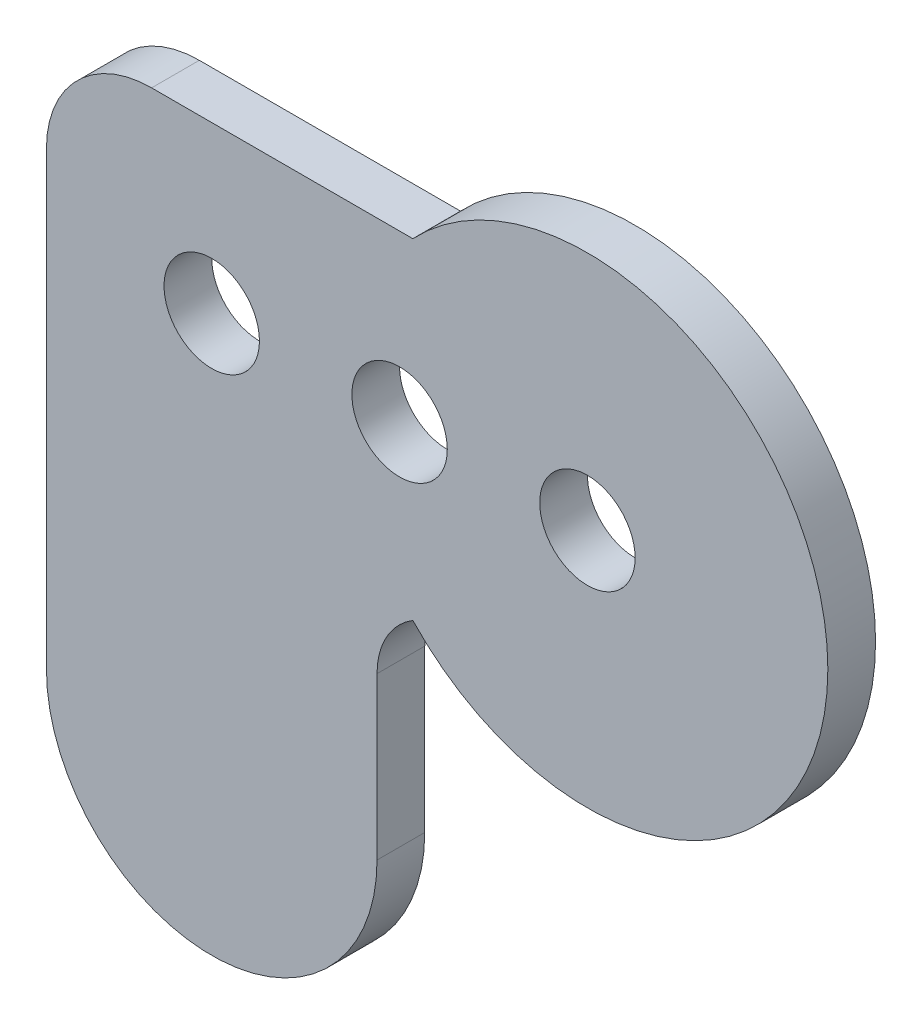
ISO-10303-21;
HEADER;
FILE_DESCRIPTION(('STEP AP214'),'2;1');
FILE_NAME('part.step','',(''),(''),'','','');
FILE_SCHEMA(('AUTOMOTIVE_DESIGN { 1 0 10303 214 1 1 1 1 }'));
ENDSEC;
DATA;
#1=APPLICATION_CONTEXT('core data for automotive mechanical design processes');
#2=APPLICATION_PROTOCOL_DEFINITION('international standard','automotive_design',2000,#1);
#3=PRODUCT_CONTEXT('',#1,'mechanical');
#4=PRODUCT('Part','Part','',(#3));
#5=PRODUCT_RELATED_PRODUCT_CATEGORY('part','',(#4));
#6=PRODUCT_DEFINITION_FORMATION('','',#4);
#7=PRODUCT_DEFINITION_CONTEXT('part definition',#1,'design');
#8=PRODUCT_DEFINITION('design','',#6,#7);
#9=PRODUCT_DEFINITION_SHAPE('','',#8);
#10=(LENGTH_UNIT() NAMED_UNIT(*) SI_UNIT(.MILLI.,.METRE.));
#11=(NAMED_UNIT(*) PLANE_ANGLE_UNIT() SI_UNIT($,.RADIAN.));
#12=(NAMED_UNIT(*) SI_UNIT($,.STERADIAN.) SOLID_ANGLE_UNIT());
#13=UNCERTAINTY_MEASURE_WITH_UNIT(LENGTH_MEASURE(1.E-05),#10,'distance_accuracy_value','');
#14=(GEOMETRIC_REPRESENTATION_CONTEXT(3) GLOBAL_UNCERTAINTY_ASSIGNED_CONTEXT((#13)) GLOBAL_UNIT_ASSIGNED_CONTEXT((#10,
#11,#12)) REPRESENTATION_CONTEXT('',''));
#15=CARTESIAN_POINT('',(0.,0.,0.));
#16=DIRECTION('',(0.,0.,1.));
#17=DIRECTION('',(1.,0.,0.));
#18=AXIS2_PLACEMENT_3D('',#15,#16,#17);
#19=CARTESIAN_POINT('',(0.,0.,3.175));
#20=DIRECTION('',(0.,0.,-1.));
#21=DIRECTION('',(-1.,0.,0.));
#22=AXIS2_PLACEMENT_3D('',#19,#20,#21);
#23=CYLINDRICAL_SURFACE('',#22,16.);
#24=CARTESIAN_POINT('',(0.,0.,0.));
#25=DIRECTION('',(0.,0.,1.));
#26=DIRECTION('',(1.,0.,0.));
#27=AXIS2_PLACEMENT_3D('',#24,#25,#26);
#28=CIRCLE('',#27,16.);
#29=CARTESIAN_POINT('',(-11.6189500386223,-11.,0.));
#30=VERTEX_POINT('',#29);
#31=CARTESIAN_POINT('',(-11.6189500386223,11.,0.));
#32=VERTEX_POINT('',#31);
#33=EDGE_CURVE('E115',#30,#32,#28,.T.);
#34=ORIENTED_EDGE('',*,*,#33,.T.);
#35=DIRECTION('',(0.,0.,-1.));
#36=VECTOR('',#35,1.);
#37=CARTESIAN_POINT('',(-11.6189500386223,11.,3.175));
#38=LINE('',#37,#36);
#39=CARTESIAN_POINT('',(-11.6189500386223,11.,3.175));
#40=VERTEX_POINT('',#39);
#41=EDGE_CURVE('E98',#40,#32,#38,.T.);
#42=ORIENTED_EDGE('',*,*,#41,.F.);
#43=CARTESIAN_POINT('',(0.,0.,3.175));
#44=DIRECTION('',(0.,0.,1.));
#45=DIRECTION('',(1.,0.,0.));
#46=AXIS2_PLACEMENT_3D('',#43,#44,#45);
#47=CIRCLE('',#46,16.);
#48=CARTESIAN_POINT('',(-11.6189500386223,-11.,3.175));
#49=VERTEX_POINT('',#48);
#50=EDGE_CURVE('E105',#49,#40,#47,.T.);
#51=ORIENTED_EDGE('',*,*,#50,.F.);
#52=DIRECTION('',(0.,0.,-1.));
#53=VECTOR('',#52,1.);
#54=CARTESIAN_POINT('',(-11.6189500386223,-11.,3.175));
#55=LINE('',#54,#53);
#56=EDGE_CURVE('E155',#49,#30,#55,.T.);
#57=ORIENTED_EDGE('',*,*,#56,.T.);
#58=EDGE_LOOP('',(#34,#42,#51,#57));
#59=FACE_BOUND('',#58,.T.);
#60=ADVANCED_FACE('F34',(#59),#23,.T.);
#61=CARTESIAN_POINT('',(-11.6189500386223,11.,3.175));
#62=DIRECTION('',(0.,-1.,0.));
#63=DIRECTION('',(1.,0.,0.));
#64=AXIS2_PLACEMENT_3D('',#61,#62,#63);
#65=PLANE('',#64);
#66=DIRECTION('',(-1.,0.,0.));
#67=VECTOR('',#66,1.);
#68=CARTESIAN_POINT('',(-11.6189500386223,11.,0.));
#69=LINE('',#68,#67);
#70=CARTESIAN_POINT('',(-29.,11.,0.));
#71=VERTEX_POINT('',#70);
#72=EDGE_CURVE('E143',#32,#71,#69,.T.);
#73=ORIENTED_EDGE('',*,*,#72,.T.);
#74=DIRECTION('',(0.,0.,-1.));
#75=VECTOR('',#74,1.);
#76=CARTESIAN_POINT('',(-29.,11.,3.175));
#77=LINE('',#76,#75);
#78=CARTESIAN_POINT('',(-29.,11.,3.175));
#79=VERTEX_POINT('',#78);
#80=EDGE_CURVE('E101',#71,#79,#77,.F.);
#81=ORIENTED_EDGE('',*,*,#80,.T.);
#82=DIRECTION('',(-1.,0.,0.));
#83=VECTOR('',#82,1.);
#84=CARTESIAN_POINT('',(-11.6189500386223,11.,3.175));
#85=LINE('',#84,#83);
#86=EDGE_CURVE('E93',#40,#79,#85,.T.);
#87=ORIENTED_EDGE('',*,*,#86,.F.);
#88=ORIENTED_EDGE('',*,*,#41,.T.);
#89=EDGE_LOOP('',(#73,#81,#87,#88));
#90=FACE_BOUND('',#89,.T.);
#91=ADVANCED_FACE('F96',(#90),#65,.F.);
#92=CARTESIAN_POINT('',(-36.,11.,3.175));
#93=DIRECTION('',(1.,0.,0.));
#94=DIRECTION('',(0.,1.,0.));
#95=AXIS2_PLACEMENT_3D('',#92,#93,#94);
#96=PLANE('',#95);
#97=DIRECTION('',(0.,-1.,0.));
#98=VECTOR('',#97,1.);
#99=CARTESIAN_POINT('',(-36.,11.,3.175));
#100=LINE('',#99,#98);
#101=CARTESIAN_POINT('',(-36.,3.99999999999999,3.175));
#102=VERTEX_POINT('',#101);
#103=CARTESIAN_POINT('',(-36.,-26.,3.175));
#104=VERTEX_POINT('',#103);
#105=EDGE_CURVE('E104',#102,#104,#100,.T.);
#106=ORIENTED_EDGE('',*,*,#105,.F.);
#107=DIRECTION('',(0.,0.,-1.));
#108=VECTOR('',#107,1.);
#109=CARTESIAN_POINT('',(-36.,3.99999999999999,3.175));
#110=LINE('',#109,#108);
#111=CARTESIAN_POINT('',(-36.,3.99999999999999,0.));
#112=VERTEX_POINT('',#111);
#113=EDGE_CURVE('E116',#102,#112,#110,.T.);
#114=ORIENTED_EDGE('',*,*,#113,.T.);
#115=DIRECTION('',(0.,-1.,0.));
#116=VECTOR('',#115,1.);
#117=CARTESIAN_POINT('',(-36.,11.,0.));
#118=LINE('',#117,#116);
#119=CARTESIAN_POINT('',(-36.,-26.,0.));
#120=VERTEX_POINT('',#119);
#121=EDGE_CURVE('E145',#112,#120,#118,.T.);
#122=ORIENTED_EDGE('',*,*,#121,.T.);
#123=DIRECTION('',(0.,0.,-1.));
#124=VECTOR('',#123,1.);
#125=CARTESIAN_POINT('',(-36.,-26.,3.175));
#126=LINE('',#125,#124);
#127=EDGE_CURVE('E117',#104,#120,#126,.T.);
#128=ORIENTED_EDGE('',*,*,#127,.F.);
#129=EDGE_LOOP('',(#106,#114,#122,#128));
#130=FACE_BOUND('',#129,.T.);
#131=ADVANCED_FACE('F136',(#130),#96,.F.);
#132=CARTESIAN_POINT('',(-25.,-26.,3.175));
#133=DIRECTION('',(0.,0.,-1.));
#134=DIRECTION('',(-1.,0.,0.));
#135=AXIS2_PLACEMENT_3D('',#132,#133,#134);
#136=CYLINDRICAL_SURFACE('',#135,11.);
#137=CARTESIAN_POINT('',(-25.,-26.,0.));
#138=DIRECTION('',(0.,0.,1.));
#139=DIRECTION('',(1.,0.,0.));
#140=AXIS2_PLACEMENT_3D('',#137,#138,#139);
#141=CIRCLE('',#140,11.);
#142=CARTESIAN_POINT('',(-14.,-26.,0.));
#143=VERTEX_POINT('',#142);
#144=EDGE_CURVE('E147',#120,#143,#141,.T.);
#145=ORIENTED_EDGE('',*,*,#144,.T.);
#146=DIRECTION('',(0.,0.,-1.));
#147=VECTOR('',#146,1.);
#148=CARTESIAN_POINT('',(-14.,-26.,3.175));
#149=LINE('',#148,#147);
#150=CARTESIAN_POINT('',(-14.,-26.,3.175));
#151=VERTEX_POINT('',#150);
#152=EDGE_CURVE('E123',#151,#143,#149,.T.);
#153=ORIENTED_EDGE('',*,*,#152,.F.);
#154=CARTESIAN_POINT('',(-25.,-26.,3.175));
#155=DIRECTION('',(0.,0.,1.));
#156=DIRECTION('',(1.,0.,0.));
#157=AXIS2_PLACEMENT_3D('',#154,#155,#156);
#158=CIRCLE('',#157,11.);
#159=EDGE_CURVE('E139',#104,#151,#158,.T.);
#160=ORIENTED_EDGE('',*,*,#159,.F.);
#161=ORIENTED_EDGE('',*,*,#127,.T.);
#162=EDGE_LOOP('',(#145,#153,#160,#161));
#163=FACE_BOUND('',#162,.T.);
#164=ADVANCED_FACE('F161',(#163),#136,.T.);
#165=CARTESIAN_POINT('',(-14.,-26.,3.175));
#166=DIRECTION('',(-1.,0.,0.));
#167=DIRECTION('',(0.,0.,1.));
#168=AXIS2_PLACEMENT_3D('',#165,#166,#167);
#169=PLANE('',#168);
#170=DIRECTION('',(0.,1.,0.));
#171=VECTOR('',#170,1.);
#172=CARTESIAN_POINT('',(-14.,-26.,0.));
#173=LINE('',#172,#171);
#174=CARTESIAN_POINT('',(-14.,-15.2592371024868,0.));
#175=VERTEX_POINT('',#174);
#176=EDGE_CURVE('E113',#143,#175,#173,.T.);
#177=ORIENTED_EDGE('',*,*,#176,.T.);
#178=DIRECTION('',(0.,0.,-1.));
#179=VECTOR('',#178,1.);
#180=CARTESIAN_POINT('',(-14.,-15.2592371024868,3.175));
#181=LINE('',#180,#179);
#182=CARTESIAN_POINT('',(-14.,-15.2592371024868,3.175));
#183=VERTEX_POINT('',#182);
#184=EDGE_CURVE('E49',#175,#183,#181,.F.);
#185=ORIENTED_EDGE('',*,*,#184,.T.);
#186=DIRECTION('',(0.,1.,0.));
#187=VECTOR('',#186,1.);
#188=CARTESIAN_POINT('',(-14.,-26.,3.175));
#189=LINE('',#188,#187);
#190=EDGE_CURVE('E156',#151,#183,#189,.T.);
#191=ORIENTED_EDGE('',*,*,#190,.F.);
#192=ORIENTED_EDGE('',*,*,#152,.T.);
#193=EDGE_LOOP('',(#177,#185,#191,#192));
#194=FACE_BOUND('',#193,.T.);
#195=ADVANCED_FACE('F159',(#194),#169,.F.);
#196=CARTESIAN_POINT('',(0.,0.,3.175));
#197=DIRECTION('',(0.,0.,1.));
#198=DIRECTION('',(1.,0.,0.));
#199=AXIS2_PLACEMENT_3D('',#196,#197,#198);
#200=PLANE('',#199);
#201=CARTESIAN_POINT('',(-12.5,0.,3.175));
#202=DIRECTION('',(0.,0.,1.));
#203=DIRECTION('',(1.,0.,0.));
#204=AXIS2_PLACEMENT_3D('',#201,#202,#203);
#205=CIRCLE('',#204,3.175);
#206=CARTESIAN_POINT('',(-9.325,0.,3.175));
#207=VERTEX_POINT('',#206);
#208=EDGE_CURVE('E176',#207,#207,#205,.T.);
#209=ORIENTED_EDGE('',*,*,#208,.F.);
#210=EDGE_LOOP('',(#209));
#211=FACE_BOUND('',#210,.T.);
#212=CARTESIAN_POINT('',(-25.,0.,3.175));
#213=DIRECTION('',(0.,0.,1.));
#214=DIRECTION('',(1.,0.,0.));
#215=AXIS2_PLACEMENT_3D('',#212,#213,#214);
#216=CIRCLE('',#215,3.175);
#217=CARTESIAN_POINT('',(-21.825,0.,3.175));
#218=VERTEX_POINT('',#217);
#219=EDGE_CURVE('E170',#218,#218,#216,.T.);
#220=ORIENTED_EDGE('',*,*,#219,.F.);
#221=EDGE_LOOP('',(#220));
#222=FACE_BOUND('',#221,.T.);
#223=CARTESIAN_POINT('',(0.,0.,3.175));
#224=DIRECTION('',(0.,0.,1.));
#225=DIRECTION('',(1.,0.,0.));
#226=AXIS2_PLACEMENT_3D('',#223,#224,#225);
#227=CIRCLE('',#226,3.175);
#228=CARTESIAN_POINT('',(3.175,0.,3.175));
#229=VERTEX_POINT('',#228);
#230=EDGE_CURVE('E164',#229,#229,#227,.T.);
#231=ORIENTED_EDGE('',*,*,#230,.F.);
#232=EDGE_LOOP('',(#231));
#233=FACE_BOUND('',#232,.T.);
#234=ORIENTED_EDGE('',*,*,#86,.T.);
#235=CARTESIAN_POINT('',(-29.,3.99999999999999,3.175));
#236=DIRECTION('',(0.,0.,1.));
#237=DIRECTION('',(1.,0.,0.));
#238=AXIS2_PLACEMENT_3D('',#235,#236,#237);
#239=CIRCLE('',#238,7.);
#240=EDGE_CURVE('E129',#79,#102,#239,.T.);
#241=ORIENTED_EDGE('',*,*,#240,.T.);
#242=ORIENTED_EDGE('',*,*,#105,.T.);
#243=ORIENTED_EDGE('',*,*,#159,.T.);
#244=ORIENTED_EDGE('',*,*,#190,.T.);
#245=CARTESIAN_POINT('',(-9.00000000000001,-15.2592371024868,3.175));
#246=DIRECTION('',(0.,0.,1.));
#247=DIRECTION('',(1.,0.,0.));
#248=AXIS2_PLACEMENT_3D('',#245,#246,#247);
#249=CIRCLE('',#248,5.);
#250=EDGE_CURVE('E11',#183,#49,#249,.F.);
#251=ORIENTED_EDGE('',*,*,#250,.T.);
#252=ORIENTED_EDGE('',*,*,#50,.T.);
#253=EDGE_LOOP('',(#234,#241,#242,#243,#244,#251,#252));
#254=FACE_BOUND('',#253,.T.);
#255=ADVANCED_FACE('F108',(#211,#222,#233,#254),#200,.T.);
#256=CARTESIAN_POINT('',(0.,0.,0.));
#257=DIRECTION('',(0.,0.,1.));
#258=DIRECTION('',(1.,0.,0.));
#259=AXIS2_PLACEMENT_3D('',#256,#257,#258);
#260=PLANE('',#259);
#261=CARTESIAN_POINT('',(-12.5,0.,0.));
#262=DIRECTION('',(0.,0.,1.));
#263=DIRECTION('',(1.,0.,0.));
#264=AXIS2_PLACEMENT_3D('',#261,#262,#263);
#265=CIRCLE('',#264,3.175);
#266=CARTESIAN_POINT('',(-9.325,0.,0.));
#267=VERTEX_POINT('',#266);
#268=EDGE_CURVE('E167',#267,#267,#265,.T.);
#269=ORIENTED_EDGE('',*,*,#268,.T.);
#270=EDGE_LOOP('',(#269));
#271=FACE_BOUND('',#270,.T.);
#272=CARTESIAN_POINT('',(-25.,0.,0.));
#273=DIRECTION('',(0.,0.,1.));
#274=DIRECTION('',(1.,0.,0.));
#275=AXIS2_PLACEMENT_3D('',#272,#273,#274);
#276=CIRCLE('',#275,3.175);
#277=CARTESIAN_POINT('',(-21.825,0.,0.));
#278=VERTEX_POINT('',#277);
#279=EDGE_CURVE('E173',#278,#278,#276,.T.);
#280=ORIENTED_EDGE('',*,*,#279,.T.);
#281=EDGE_LOOP('',(#280));
#282=FACE_BOUND('',#281,.T.);
#283=CARTESIAN_POINT('',(0.,0.,0.));
#284=DIRECTION('',(0.,0.,1.));
#285=DIRECTION('',(1.,0.,0.));
#286=AXIS2_PLACEMENT_3D('',#283,#284,#285);
#287=CIRCLE('',#286,3.175);
#288=CARTESIAN_POINT('',(3.175,0.,0.));
#289=VERTEX_POINT('',#288);
#290=EDGE_CURVE('E149',#289,#289,#287,.T.);
#291=ORIENTED_EDGE('',*,*,#290,.T.);
#292=EDGE_LOOP('',(#291));
#293=FACE_BOUND('',#292,.T.);
#294=ORIENTED_EDGE('',*,*,#121,.F.);
#295=CARTESIAN_POINT('',(-29.,3.99999999999999,0.));
#296=DIRECTION('',(0.,0.,1.));
#297=DIRECTION('',(1.,0.,0.));
#298=AXIS2_PLACEMENT_3D('',#295,#296,#297);
#299=CIRCLE('',#298,7.);
#300=EDGE_CURVE('E120',#112,#71,#299,.F.);
#301=ORIENTED_EDGE('',*,*,#300,.T.);
#302=ORIENTED_EDGE('',*,*,#72,.F.);
#303=ORIENTED_EDGE('',*,*,#33,.F.);
#304=CARTESIAN_POINT('',(-9.00000000000001,-15.2592371024868,0.));
#305=DIRECTION('',(0.,0.,1.));
#306=DIRECTION('',(1.,0.,0.));
#307=AXIS2_PLACEMENT_3D('',#304,#305,#306);
#308=CIRCLE('',#307,5.);
#309=EDGE_CURVE('E42',#30,#175,#308,.T.);
#310=ORIENTED_EDGE('',*,*,#309,.T.);
#311=ORIENTED_EDGE('',*,*,#176,.F.);
#312=ORIENTED_EDGE('',*,*,#144,.F.);
#313=EDGE_LOOP('',(#294,#301,#302,#303,#310,#311,#312));
#314=FACE_BOUND('',#313,.T.);
#315=ADVANCED_FACE('F142',(#271,#282,#293,#314),#260,.F.);
#316=CARTESIAN_POINT('',(-29.,3.99999999999999,3.175));
#317=DIRECTION('',(0.,0.,-1.));
#318=DIRECTION('',(-1.,0.,0.));
#319=AXIS2_PLACEMENT_3D('',#316,#317,#318);
#320=CYLINDRICAL_SURFACE('',#319,7.);
#321=ORIENTED_EDGE('',*,*,#240,.F.);
#322=ORIENTED_EDGE('',*,*,#80,.F.);
#323=ORIENTED_EDGE('',*,*,#300,.F.);
#324=ORIENTED_EDGE('',*,*,#113,.F.);
#325=EDGE_LOOP('',(#321,#322,#323,#324));
#326=FACE_BOUND('',#325,.T.);
#327=ADVANCED_FACE('F141',(#326),#320,.T.);
#328=CARTESIAN_POINT('',(-9.00000000000001,-15.2592371024868,3.175));
#329=DIRECTION('',(0.,0.,-1.));
#330=DIRECTION('',(-1.,0.,0.));
#331=AXIS2_PLACEMENT_3D('',#328,#329,#330);
#332=CYLINDRICAL_SURFACE('',#331,5.);
#333=ORIENTED_EDGE('',*,*,#250,.F.);
#334=ORIENTED_EDGE('',*,*,#184,.F.);
#335=ORIENTED_EDGE('',*,*,#309,.F.);
#336=ORIENTED_EDGE('',*,*,#56,.F.);
#337=EDGE_LOOP('',(#333,#334,#335,#336));
#338=FACE_BOUND('',#337,.T.);
#339=ADVANCED_FACE('F36',(#338),#332,.F.);
#340=CARTESIAN_POINT('',(0.,0.,0.));
#341=DIRECTION('',(0.,0.,1.));
#342=DIRECTION('',(1.,0.,0.));
#343=AXIS2_PLACEMENT_3D('',#340,#341,#342);
#344=CYLINDRICAL_SURFACE('',#343,3.175);
#345=ORIENTED_EDGE('',*,*,#290,.F.);
#346=EDGE_LOOP('',(#345));
#347=FACE_BOUND('',#346,.T.);
#348=ORIENTED_EDGE('',*,*,#230,.T.);
#349=EDGE_LOOP('',(#348));
#350=FACE_BOUND('',#349,.T.);
#351=ADVANCED_FACE('F198',(#347,#350),#344,.F.);
#352=CARTESIAN_POINT('',(-25.,0.,0.));
#353=DIRECTION('',(0.,0.,1.));
#354=DIRECTION('',(1.,0.,0.));
#355=AXIS2_PLACEMENT_3D('',#352,#353,#354);
#356=CYLINDRICAL_SURFACE('',#355,3.175);
#357=ORIENTED_EDGE('',*,*,#279,.F.);
#358=EDGE_LOOP('',(#357));
#359=FACE_BOUND('',#358,.T.);
#360=ORIENTED_EDGE('',*,*,#219,.T.);
#361=EDGE_LOOP('',(#360));
#362=FACE_BOUND('',#361,.T.);
#363=ADVANCED_FACE('F187',(#359,#362),#356,.F.);
#364=CARTESIAN_POINT('',(-12.5,0.,0.));
#365=DIRECTION('',(0.,0.,1.));
#366=DIRECTION('',(1.,0.,0.));
#367=AXIS2_PLACEMENT_3D('',#364,#365,#366);
#368=CYLINDRICAL_SURFACE('',#367,3.175);
#369=ORIENTED_EDGE('',*,*,#268,.F.);
#370=EDGE_LOOP('',(#369));
#371=FACE_BOUND('',#370,.T.);
#372=ORIENTED_EDGE('',*,*,#208,.T.);
#373=EDGE_LOOP('',(#372));
#374=FACE_BOUND('',#373,.T.);
#375=ADVANCED_FACE('F184',(#371,#374),#368,.F.);
#376=CLOSED_SHELL('',(#60,#91,#131,#164,#195,#255,#315,#327,#339,#351,#363,#375));
#377=MANIFOLD_SOLID_BREP('B2',#376);
#378=ADVANCED_BREP_SHAPE_REPRESENTATION('',(#18,#377),#14);
#379=SHAPE_DEFINITION_REPRESENTATION(#9,#378);
ENDSEC;
END-ISO-10303-21;
